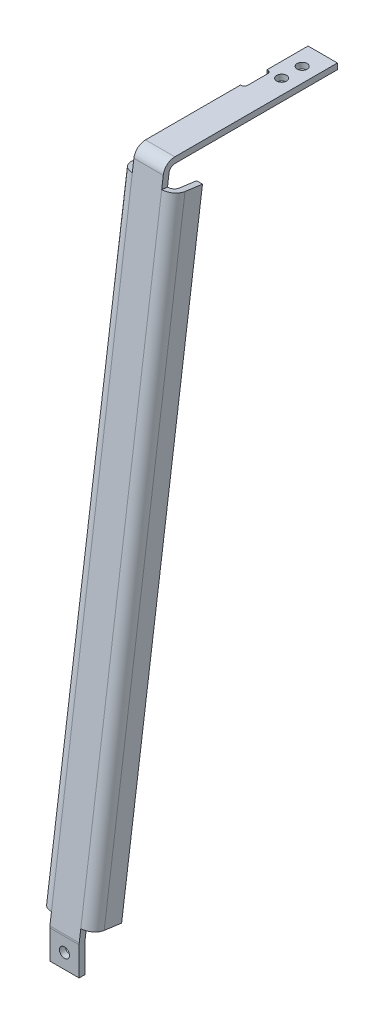
ISO-10303-21;
HEADER;
FILE_DESCRIPTION(('STEP AP214'),'2;1');
FILE_NAME('part.step','',(''),(''),'','','');
FILE_SCHEMA(('AUTOMOTIVE_DESIGN { 1 0 10303 214 1 1 1 1 }'));
ENDSEC;
DATA;
#1=APPLICATION_CONTEXT('core data for automotive mechanical design processes');
#2=APPLICATION_PROTOCOL_DEFINITION('international standard','automotive_design',2000,#1);
#3=PRODUCT_CONTEXT('',#1,'mechanical');
#4=PRODUCT('Part','Part','',(#3));
#5=PRODUCT_RELATED_PRODUCT_CATEGORY('part','',(#4));
#6=PRODUCT_DEFINITION_FORMATION('','',#4);
#7=PRODUCT_DEFINITION_CONTEXT('part definition',#1,'design');
#8=PRODUCT_DEFINITION('design','',#6,#7);
#9=PRODUCT_DEFINITION_SHAPE('','',#8);
#10=(LENGTH_UNIT() NAMED_UNIT(*) SI_UNIT(.MILLI.,.METRE.));
#11=(NAMED_UNIT(*) PLANE_ANGLE_UNIT() SI_UNIT($,.RADIAN.));
#12=(NAMED_UNIT(*) SI_UNIT($,.STERADIAN.) SOLID_ANGLE_UNIT());
#13=UNCERTAINTY_MEASURE_WITH_UNIT(LENGTH_MEASURE(1.E-05),#10,'distance_accuracy_value','');
#14=(GEOMETRIC_REPRESENTATION_CONTEXT(3) GLOBAL_UNCERTAINTY_ASSIGNED_CONTEXT((#13)) GLOBAL_UNIT_ASSIGNED_CONTEXT((#10,
#11,#12)) REPRESENTATION_CONTEXT('',''));
#15=CARTESIAN_POINT('',(0.,0.,0.));
#16=DIRECTION('',(0.,0.,1.));
#17=DIRECTION('',(1.,0.,0.));
#18=AXIS2_PLACEMENT_3D('',#15,#16,#17);
#19=CARTESIAN_POINT('',(-30.,-68.,77.3774837469467));
#20=DIRECTION('',(1.,0.,0.));
#21=DIRECTION('',(0.,0.,-1.));
#22=AXIS2_PLACEMENT_3D('',#19,#20,#21);
#23=PLANE('',#22);
#24=DIRECTION('',(0.,1.,0.));
#25=VECTOR('',#24,1.);
#26=CARTESIAN_POINT('',(-30.,-66.2,36.));
#27=LINE('',#26,#25);
#28=CARTESIAN_POINT('',(-30.,-66.,36.));
#29=VERTEX_POINT('',#28);
#30=CARTESIAN_POINT('',(-30.,-64.,36.));
#31=VERTEX_POINT('',#30);
#32=EDGE_CURVE('E360',#29,#31,#27,.T.);
#33=ORIENTED_EDGE('',*,*,#32,.T.);
#34=DIRECTION('',(0.,0.,1.));
#35=VECTOR('',#34,1.);
#36=CARTESIAN_POINT('',(-30.,-64.,22.));
#37=LINE('',#36,#35);
#38=CARTESIAN_POINT('',(-30.,-64.,22.));
#39=VERTEX_POINT('',#38);
#40=EDGE_CURVE('E479',#39,#31,#37,.T.);
#41=ORIENTED_EDGE('',*,*,#40,.F.);
#42=DIRECTION('',(0.,1.,0.));
#43=VECTOR('',#42,1.);
#44=CARTESIAN_POINT('',(-30.,-66.,22.));
#45=LINE('',#44,#43);
#46=CARTESIAN_POINT('',(-30.,-66.,22.));
#47=VERTEX_POINT('',#46);
#48=EDGE_CURVE('E417',#47,#39,#45,.T.);
#49=ORIENTED_EDGE('',*,*,#48,.F.);
#50=DIRECTION('',(0.,0.,-1.));
#51=VECTOR('',#50,1.);
#52=CARTESIAN_POINT('',(-30.,-66.,77.3774837469467));
#53=LINE('',#52,#51);
#54=EDGE_CURVE('E263',#29,#47,#53,.T.);
#55=ORIENTED_EDGE('',*,*,#54,.F.);
#56=EDGE_LOOP('',(#33,#41,#49,#55));
#57=FACE_BOUND('',#56,.T.);
#58=ADVANCED_FACE('F41',(#57),#23,.F.);
#59=DIRECTION('',(0.,1.,0.));
#60=VECTOR('',#59,1.);
#61=CARTESIAN_POINT('',(-30.,-66.2,45.));
#62=LINE('',#61,#60);
#63=CARTESIAN_POINT('',(-30.,-66.,45.));
#64=VERTEX_POINT('',#63);
#65=CARTESIAN_POINT('',(-30.,-64.,45.));
#66=VERTEX_POINT('',#65);
#67=EDGE_CURVE('E236',#64,#66,#62,.T.);
#68=ORIENTED_EDGE('',*,*,#67,.F.);
#69=CARTESIAN_POINT('',(-30.,-66.,77.3774837469467));
#70=VERTEX_POINT('',#69);
#71=EDGE_CURVE('E253',#70,#64,#53,.T.);
#72=ORIENTED_EDGE('',*,*,#71,.F.);
#73=CARTESIAN_POINT('',(-30.,-68.,77.3774837469467));
#74=DIRECTION('',(-1.,0.,0.));
#75=DIRECTION('',(0.,0.,-1.));
#76=AXIS2_PLACEMENT_3D('',#73,#74,#75);
#77=CIRCLE('',#76,2.);
#78=CARTESIAN_POINT('',(-30.,-67.7326535951247,79.3595346796425));
#79=VERTEX_POINT('',#78);
#80=EDGE_CURVE('E268',#79,#70,#77,.T.);
#81=ORIENTED_EDGE('',*,*,#80,.F.);
#82=DIRECTION('',(0.,0.991025466347899,-0.133673202437624));
#83=VECTOR('',#82,1.);
#84=CARTESIAN_POINT('',(-30.,-279.934067195348,107.982050932696));
#85=LINE('',#84,#83);
#86=CARTESIAN_POINT('',(-30.,-71.6967554605164,79.894227489393));
#87=VERTEX_POINT('',#86);
#88=EDGE_CURVE('E500',#87,#79,#85,.T.);
#89=ORIENTED_EDGE('',*,*,#88,.F.);
#90=DIRECTION('',(0.,-0.133673202437623,-0.991025466347899));
#91=VECTOR('',#90,1.);
#92=CARTESIAN_POINT('',(-30.,-71.9641018653916,77.9121765566972));
#93=LINE('',#92,#91);
#94=CARTESIAN_POINT('',(-30.,-71.4294090556411,81.8762784220888));
#95=VERTEX_POINT('',#94);
#96=EDGE_CURVE('E307',#95,#87,#93,.T.);
#97=ORIENTED_EDGE('',*,*,#96,.F.);
#98=DIRECTION('',(0.,-0.991025466347899,0.133673202437623));
#99=VECTOR('',#98,1.);
#100=CARTESIAN_POINT('',(-30.,-67.4653071902495,81.3415856123383));
#101=LINE('',#100,#99);
#102=CARTESIAN_POINT('',(-30.,-67.4653071902495,81.3415856123383));
#103=VERTEX_POINT('',#102);
#104=EDGE_CURVE('E484',#103,#95,#101,.T.);
#105=ORIENTED_EDGE('',*,*,#104,.F.);
#106=CARTESIAN_POINT('',(-30.,-68.,77.3774837469467));
#107=DIRECTION('',(1.,0.,0.));
#108=DIRECTION('',(0.,0.,-1.));
#109=AXIS2_PLACEMENT_3D('',#106,#107,#108);
#110=CIRCLE('',#109,4.00000000000001);
#111=CARTESIAN_POINT('',(-30.,-64.,77.3774837469467));
#112=VERTEX_POINT('',#111);
#113=EDGE_CURVE('E485',#112,#103,#110,.T.);
#114=ORIENTED_EDGE('',*,*,#113,.F.);
#115=EDGE_CURVE('E251',#66,#112,#37,.T.);
#116=ORIENTED_EDGE('',*,*,#115,.F.);
#117=EDGE_LOOP('',(#68,#72,#81,#89,#97,#105,#114,#116));
#118=FACE_BOUND('',#117,.T.);
#119=ADVANCED_FACE('F246',(#118),#23,.F.);
#120=CARTESIAN_POINT('',(-20.,-68.,77.3774837469467));
#121=DIRECTION('',(1.,0.,0.));
#122=DIRECTION('',(0.,0.,-1.));
#123=AXIS2_PLACEMENT_3D('',#120,#121,#122);
#124=PLANE('',#123);
#125=DIRECTION('',(0.,-0.991025466347899,0.133673202437623));
#126=VECTOR('',#125,1.);
#127=CARTESIAN_POINT('',(-20.,-67.4653071902495,81.3415856123383));
#128=LINE('',#127,#126);
#129=CARTESIAN_POINT('',(-20.,-67.4653071902495,81.3415856123383));
#130=VERTEX_POINT('',#129);
#131=CARTESIAN_POINT('',(-20.,-71.4294090556411,81.8762784220888));
#132=VERTEX_POINT('',#131);
#133=EDGE_CURVE('E460',#130,#132,#128,.T.);
#134=ORIENTED_EDGE('',*,*,#133,.T.);
#135=DIRECTION('',(0.,-0.133673202437623,-0.991025466347899));
#136=VECTOR('',#135,1.);
#137=CARTESIAN_POINT('',(-20.,-71.9641018653916,77.9121765566972));
#138=LINE('',#137,#136);
#139=CARTESIAN_POINT('',(-20.,-71.6967554605163,79.894227489393));
#140=VERTEX_POINT('',#139);
#141=EDGE_CURVE('E315',#132,#140,#138,.T.);
#142=ORIENTED_EDGE('',*,*,#141,.T.);
#143=DIRECTION('',(0.,0.991025466347899,-0.133673202437624));
#144=VECTOR('',#143,1.);
#145=CARTESIAN_POINT('',(-20.,-279.934067195348,107.982050932696));
#146=LINE('',#145,#144);
#147=CARTESIAN_POINT('',(-20.,-67.7326535951247,79.3595346796425));
#148=VERTEX_POINT('',#147);
#149=EDGE_CURVE('E468',#140,#148,#146,.T.);
#150=ORIENTED_EDGE('',*,*,#149,.T.);
#151=CARTESIAN_POINT('',(-20.,-68.,77.3774837469467));
#152=DIRECTION('',(-1.,0.,0.));
#153=DIRECTION('',(0.,0.,-1.));
#154=AXIS2_PLACEMENT_3D('',#151,#152,#153);
#155=CIRCLE('',#154,2.);
#156=CARTESIAN_POINT('',(-20.,-66.,77.3774837469467));
#157=VERTEX_POINT('',#156);
#158=EDGE_CURVE('E475',#148,#157,#155,.T.);
#159=ORIENTED_EDGE('',*,*,#158,.T.);
#160=DIRECTION('',(0.,0.,-1.));
#161=VECTOR('',#160,1.);
#162=CARTESIAN_POINT('',(-20.,-66.,77.3774837469467));
#163=LINE('',#162,#161);
#164=CARTESIAN_POINT('',(-20.,-66.,22.));
#165=VERTEX_POINT('',#164);
#166=EDGE_CURVE('E274',#157,#165,#163,.T.);
#167=ORIENTED_EDGE('',*,*,#166,.T.);
#168=DIRECTION('',(0.,1.,0.));
#169=VECTOR('',#168,1.);
#170=CARTESIAN_POINT('',(-20.,-66.,22.));
#171=LINE('',#170,#169);
#172=CARTESIAN_POINT('',(-20.,-64.,22.));
#173=VERTEX_POINT('',#172);
#174=EDGE_CURVE('E265',#165,#173,#171,.T.);
#175=ORIENTED_EDGE('',*,*,#174,.T.);
#176=DIRECTION('',(0.,0.,1.));
#177=VECTOR('',#176,1.);
#178=CARTESIAN_POINT('',(-20.,-64.,22.));
#179=LINE('',#178,#177);
#180=CARTESIAN_POINT('',(-20.,-64.,77.3774837469467));
#181=VERTEX_POINT('',#180);
#182=EDGE_CURVE('E266',#173,#181,#179,.T.);
#183=ORIENTED_EDGE('',*,*,#182,.T.);
#184=CARTESIAN_POINT('',(-20.,-68.,77.3774837469467));
#185=DIRECTION('',(1.,0.,0.));
#186=DIRECTION('',(0.,0.,-1.));
#187=AXIS2_PLACEMENT_3D('',#184,#185,#186);
#188=CIRCLE('',#187,4.00000000000001);
#189=EDGE_CURVE('E451',#181,#130,#188,.T.);
#190=ORIENTED_EDGE('',*,*,#189,.T.);
#191=EDGE_LOOP('',(#134,#142,#150,#159,#167,#175,#183,#190));
#192=FACE_BOUND('',#191,.T.);
#193=ADVANCED_FACE('F515',(#192),#124,.T.);
#194=CARTESIAN_POINT('',(-20.,-66.,22.));
#195=DIRECTION('',(0.,0.,1.));
#196=DIRECTION('',(1.,0.,0.));
#197=AXIS2_PLACEMENT_3D('',#194,#195,#196);
#198=PLANE('',#197);
#199=ORIENTED_EDGE('',*,*,#48,.T.);
#200=DIRECTION('',(-1.,0.,0.));
#201=VECTOR('',#200,1.);
#202=CARTESIAN_POINT('',(-20.,-64.,22.));
#203=LINE('',#202,#201);
#204=EDGE_CURVE('E301',#173,#39,#203,.T.);
#205=ORIENTED_EDGE('',*,*,#204,.F.);
#206=ORIENTED_EDGE('',*,*,#174,.F.);
#207=DIRECTION('',(-1.,0.,0.));
#208=VECTOR('',#207,1.);
#209=CARTESIAN_POINT('',(-20.,-66.,22.));
#210=LINE('',#209,#208);
#211=EDGE_CURVE('E275',#165,#47,#210,.T.);
#212=ORIENTED_EDGE('',*,*,#211,.T.);
#213=EDGE_LOOP('',(#199,#205,#206,#212));
#214=FACE_BOUND('',#213,.T.);
#215=ADVANCED_FACE('F43',(#214),#198,.F.);
#216=CARTESIAN_POINT('',(-20.,-64.,22.));
#217=DIRECTION('',(0.,-1.,0.));
#218=DIRECTION('',(0.,0.,-1.));
#219=AXIS2_PLACEMENT_3D('',#216,#217,#218);
#220=PLANE('',#219);
#221=DIRECTION('',(-1.,0.,0.));
#222=VECTOR('',#221,1.);
#223=CARTESIAN_POINT('',(-20.,-64.,36.));
#224=LINE('',#223,#222);
#225=CARTESIAN_POINT('',(-29.7,-64.,36.));
#226=VERTEX_POINT('',#225);
#227=EDGE_CURVE('E330',#226,#31,#224,.T.);
#228=ORIENTED_EDGE('',*,*,#227,.F.);
#229=CARTESIAN_POINT('',(-29.7,-64.,37.));
#230=DIRECTION('',(0.,-1.,0.));
#231=DIRECTION('',(0.,0.,-1.));
#232=AXIS2_PLACEMENT_3D('',#229,#230,#231);
#233=CIRCLE('',#232,0.999999999999997);
#234=CARTESIAN_POINT('',(-28.7,-64.,37.));
#235=VERTEX_POINT('',#234);
#236=EDGE_CURVE('E364',#235,#226,#233,.F.);
#237=ORIENTED_EDGE('',*,*,#236,.F.);
#238=DIRECTION('',(0.,0.,-1.));
#239=VECTOR('',#238,1.);
#240=CARTESIAN_POINT('',(-28.7,-64.,22.));
#241=LINE('',#240,#239);
#242=CARTESIAN_POINT('',(-28.7,-64.,44.));
#243=VERTEX_POINT('',#242);
#244=EDGE_CURVE('E350',#243,#235,#241,.T.);
#245=ORIENTED_EDGE('',*,*,#244,.F.);
#246=CARTESIAN_POINT('',(-29.7,-64.,44.));
#247=DIRECTION('',(0.,-1.,0.));
#248=DIRECTION('',(0.,0.,-1.));
#249=AXIS2_PLACEMENT_3D('',#246,#247,#248);
#250=CIRCLE('',#249,1.);
#251=CARTESIAN_POINT('',(-29.7,-64.,45.));
#252=VERTEX_POINT('',#251);
#253=EDGE_CURVE('E351',#252,#243,#250,.F.);
#254=ORIENTED_EDGE('',*,*,#253,.F.);
#255=DIRECTION('',(1.,0.,0.));
#256=VECTOR('',#255,1.);
#257=CARTESIAN_POINT('',(-20.,-64.,45.));
#258=LINE('',#257,#256);
#259=EDGE_CURVE('E363',#66,#252,#258,.T.);
#260=ORIENTED_EDGE('',*,*,#259,.F.);
#261=ORIENTED_EDGE('',*,*,#115,.T.);
#262=DIRECTION('',(-1.,0.,0.));
#263=VECTOR('',#262,1.);
#264=CARTESIAN_POINT('',(-20.,-64.,77.3774837469467));
#265=LINE('',#264,#263);
#266=EDGE_CURVE('E302',#181,#112,#265,.T.);
#267=ORIENTED_EDGE('',*,*,#266,.F.);
#268=ORIENTED_EDGE('',*,*,#182,.F.);
#269=ORIENTED_EDGE('',*,*,#204,.T.);
#270=ORIENTED_EDGE('',*,*,#40,.T.);
#271=EDGE_LOOP('',(#228,#237,#245,#254,#260,#261,#267,#268,#269,#270));
#272=FACE_BOUND('',#271,.T.);
#273=CARTESIAN_POINT('',(-25.,-64.,29.));
#274=DIRECTION('',(0.,-1.,0.));
#275=DIRECTION('',(0.,0.,-1.));
#276=AXIS2_PLACEMENT_3D('',#273,#274,#275);
#277=CIRCLE('',#276,1.7);
#278=CARTESIAN_POINT('',(-25.,-64.,27.3));
#279=VERTEX_POINT('',#278);
#280=EDGE_CURVE('E322',#279,#279,#277,.F.);
#281=ORIENTED_EDGE('',*,*,#280,.F.);
#282=EDGE_LOOP('',(#281));
#283=FACE_BOUND('',#282,.T.);
#284=CARTESIAN_POINT('',(-25.,-64.,36.));
#285=DIRECTION('',(0.,-1.,0.));
#286=DIRECTION('',(0.,0.,-1.));
#287=AXIS2_PLACEMENT_3D('',#284,#285,#286);
#288=CIRCLE('',#287,1.7);
#289=CARTESIAN_POINT('',(-25.,-64.,34.3));
#290=VERTEX_POINT('',#289);
#291=EDGE_CURVE('E317',#290,#290,#288,.F.);
#292=ORIENTED_EDGE('',*,*,#291,.F.);
#293=EDGE_LOOP('',(#292));
#294=FACE_BOUND('',#293,.T.);
#295=ADVANCED_FACE('F573',(#272,#283,#294),#220,.F.);
#296=CARTESIAN_POINT('',(-20.,-68.,77.3774837469467));
#297=DIRECTION('',(-1.,0.,0.));
#298=DIRECTION('',(0.,0.,1.));
#299=AXIS2_PLACEMENT_3D('',#296,#297,#298);
#300=CYLINDRICAL_SURFACE('',#299,4.00000000000001);
#301=ORIENTED_EDGE('',*,*,#113,.T.);
#302=DIRECTION('',(-1.,0.,0.));
#303=VECTOR('',#302,1.);
#304=CARTESIAN_POINT('',(-20.,-67.4653071902495,81.3415856123383));
#305=LINE('',#304,#303);
#306=EDGE_CURVE('E296',#130,#103,#305,.T.);
#307=ORIENTED_EDGE('',*,*,#306,.F.);
#308=ORIENTED_EDGE('',*,*,#189,.F.);
#309=ORIENTED_EDGE('',*,*,#266,.T.);
#310=EDGE_LOOP('',(#301,#307,#308,#309));
#311=FACE_BOUND('',#310,.T.);
#312=ADVANCED_FACE('F570',(#311),#300,.T.);
#313=CARTESIAN_POINT('',(-20.,-67.4653071902495,81.3415856123383));
#314=DIRECTION('',(0.,-0.133673202437623,-0.991025466347899));
#315=DIRECTION('',(0.,0.991025466347899,-0.133673202437623));
#316=AXIS2_PLACEMENT_3D('',#313,#314,#315);
#317=PLANE('',#316);
#318=ORIENTED_EDGE('',*,*,#104,.T.);
#319=DIRECTION('',(0.,0.991025466347899,-0.133673202437623));
#320=VECTOR('',#319,1.);
#321=CARTESIAN_POINT('',(-30.,-275.702618925081,109.429409055641));
#322=LINE('',#321,#320);
#323=CARTESIAN_POINT('',(-30.,-275.702618925081,109.429409055641));
#324=VERTEX_POINT('',#323);
#325=EDGE_CURVE('E389',#324,#95,#322,.T.);
#326=ORIENTED_EDGE('',*,*,#325,.F.);
#327=CARTESIAN_POINT('',(-30.,-279.666720790473,109.964101865392));
#328=VERTEX_POINT('',#327);
#329=EDGE_CURVE('E482',#324,#328,#101,.T.);
#330=ORIENTED_EDGE('',*,*,#329,.T.);
#331=DIRECTION('',(-1.,0.,0.));
#332=VECTOR('',#331,1.);
#333=CARTESIAN_POINT('',(-20.,-279.666720790473,109.964101865392));
#334=LINE('',#333,#332);
#335=CARTESIAN_POINT('',(-20.,-279.666720790473,109.964101865392));
#336=VERTEX_POINT('',#335);
#337=EDGE_CURVE('E293',#336,#328,#334,.T.);
#338=ORIENTED_EDGE('',*,*,#337,.F.);
#339=CARTESIAN_POINT('',(-20.,-275.702618925081,109.429409055641));
#340=VERTEX_POINT('',#339);
#341=EDGE_CURVE('E457',#340,#336,#128,.T.);
#342=ORIENTED_EDGE('',*,*,#341,.F.);
#343=DIRECTION('',(0.,0.991025466347899,-0.133673202437623));
#344=VECTOR('',#343,1.);
#345=CARTESIAN_POINT('',(-20.,-275.702618925081,109.429409055641));
#346=LINE('',#345,#344);
#347=EDGE_CURVE('E372',#340,#132,#346,.T.);
#348=ORIENTED_EDGE('',*,*,#347,.T.);
#349=ORIENTED_EDGE('',*,*,#133,.F.);
#350=ORIENTED_EDGE('',*,*,#306,.T.);
#351=EDGE_LOOP('',(#318,#326,#330,#338,#342,#348,#349,#350));
#352=FACE_BOUND('',#351,.T.);
#353=ADVANCED_FACE('F564',(#352),#317,.F.);
#354=CARTESIAN_POINT('',(-20.,-280.201413600223,106.));
#355=DIRECTION('',(-1.,0.,0.));
#356=DIRECTION('',(0.,0.,1.));
#357=AXIS2_PLACEMENT_3D('',#354,#355,#356);
#358=CYLINDRICAL_SURFACE('',#357,3.99999999999999);
#359=CARTESIAN_POINT('',(-30.,-280.201413600223,106.));
#360=DIRECTION('',(1.,0.,0.));
#361=DIRECTION('',(0.,0.,-1.));
#362=AXIS2_PLACEMENT_3D('',#359,#360,#361);
#363=CIRCLE('',#362,3.99999999999999);
#364=CARTESIAN_POINT('',(-30.,-280.201413600223,110.));
#365=VERTEX_POINT('',#364);
#366=EDGE_CURVE('E488',#328,#365,#363,.T.);
#367=ORIENTED_EDGE('',*,*,#366,.T.);
#368=DIRECTION('',(-1.,0.,0.));
#369=VECTOR('',#368,1.);
#370=CARTESIAN_POINT('',(-20.,-280.201413600223,110.));
#371=LINE('',#370,#369);
#372=CARTESIAN_POINT('',(-20.,-280.201413600223,110.));
#373=VERTEX_POINT('',#372);
#374=EDGE_CURVE('E295',#373,#365,#371,.T.);
#375=ORIENTED_EDGE('',*,*,#374,.F.);
#376=CARTESIAN_POINT('',(-20.,-280.201413600223,106.));
#377=DIRECTION('',(1.,0.,0.));
#378=DIRECTION('',(0.,0.,-1.));
#379=AXIS2_PLACEMENT_3D('',#376,#377,#378);
#380=CIRCLE('',#379,3.99999999999999);
#381=EDGE_CURVE('E458',#336,#373,#380,.T.);
#382=ORIENTED_EDGE('',*,*,#381,.F.);
#383=ORIENTED_EDGE('',*,*,#337,.T.);
#384=EDGE_LOOP('',(#367,#375,#382,#383));
#385=FACE_BOUND('',#384,.T.);
#386=ADVANCED_FACE('F874',(#385),#358,.T.);
#387=CARTESIAN_POINT('',(-20.,-280.201413600223,110.));
#388=DIRECTION('',(0.,0.,-1.));
#389=DIRECTION('',(0.,1.,0.));
#390=AXIS2_PLACEMENT_3D('',#387,#388,#389);
#391=PLANE('',#390);
#392=CARTESIAN_POINT('',(-25.,-285.,110.));
#393=DIRECTION('',(0.,0.,-1.));
#394=DIRECTION('',(0.,1.,0.));
#395=AXIS2_PLACEMENT_3D('',#392,#393,#394);
#396=CIRCLE('',#395,1.7);
#397=CARTESIAN_POINT('',(-25.,-283.3,110.));
#398=VERTEX_POINT('',#397);
#399=EDGE_CURVE('E319',#398,#398,#396,.F.);
#400=ORIENTED_EDGE('',*,*,#399,.F.);
#401=EDGE_LOOP('',(#400));
#402=FACE_BOUND('',#401,.T.);
#403=DIRECTION('',(0.,-1.,0.));
#404=VECTOR('',#403,1.);
#405=CARTESIAN_POINT('',(-30.,-280.201413600223,110.));
#406=LINE('',#405,#404);
#407=CARTESIAN_POINT('',(-30.,-290.,110.));
#408=VERTEX_POINT('',#407);
#409=EDGE_CURVE('E489',#365,#408,#406,.T.);
#410=ORIENTED_EDGE('',*,*,#409,.T.);
#411=DIRECTION('',(-1.,0.,0.));
#412=VECTOR('',#411,1.);
#413=CARTESIAN_POINT('',(-20.,-290.,110.));
#414=LINE('',#413,#412);
#415=CARTESIAN_POINT('',(-20.,-290.,110.));
#416=VERTEX_POINT('',#415);
#417=EDGE_CURVE('E286',#416,#408,#414,.T.);
#418=ORIENTED_EDGE('',*,*,#417,.F.);
#419=DIRECTION('',(0.,-1.,0.));
#420=VECTOR('',#419,1.);
#421=CARTESIAN_POINT('',(-20.,-280.201413600223,110.));
#422=LINE('',#421,#420);
#423=EDGE_CURVE('E465',#373,#416,#422,.T.);
#424=ORIENTED_EDGE('',*,*,#423,.F.);
#425=ORIENTED_EDGE('',*,*,#374,.T.);
#426=EDGE_LOOP('',(#410,#418,#424,#425));
#427=FACE_BOUND('',#426,.T.);
#428=ADVANCED_FACE('F870',(#402,#427),#391,.F.);
#429=CARTESIAN_POINT('',(-20.,-290.,110.));
#430=DIRECTION('',(0.,1.,0.));
#431=DIRECTION('',(0.,0.,1.));
#432=AXIS2_PLACEMENT_3D('',#429,#430,#431);
#433=PLANE('',#432);
#434=DIRECTION('',(0.,0.,-1.));
#435=VECTOR('',#434,1.);
#436=CARTESIAN_POINT('',(-30.,-290.,110.));
#437=LINE('',#436,#435);
#438=CARTESIAN_POINT('',(-30.,-290.,108.));
#439=VERTEX_POINT('',#438);
#440=EDGE_CURVE('E495',#408,#439,#437,.T.);
#441=ORIENTED_EDGE('',*,*,#440,.T.);
#442=DIRECTION('',(-1.,0.,0.));
#443=VECTOR('',#442,1.);
#444=CARTESIAN_POINT('',(-20.,-290.,108.));
#445=LINE('',#444,#443);
#446=CARTESIAN_POINT('',(-20.,-290.,108.));
#447=VERTEX_POINT('',#446);
#448=EDGE_CURVE('E287',#447,#439,#445,.T.);
#449=ORIENTED_EDGE('',*,*,#448,.F.);
#450=DIRECTION('',(0.,0.,-1.));
#451=VECTOR('',#450,1.);
#452=CARTESIAN_POINT('',(-20.,-290.,110.));
#453=LINE('',#452,#451);
#454=EDGE_CURVE('E464',#416,#447,#453,.T.);
#455=ORIENTED_EDGE('',*,*,#454,.F.);
#456=ORIENTED_EDGE('',*,*,#417,.T.);
#457=EDGE_LOOP('',(#441,#449,#455,#456));
#458=FACE_BOUND('',#457,.T.);
#459=ADVANCED_FACE('F856',(#458),#433,.F.);
#460=CARTESIAN_POINT('',(-20.,-290.,108.));
#461=DIRECTION('',(0.,0.,1.));
#462=DIRECTION('',(1.,0.,0.));
#463=AXIS2_PLACEMENT_3D('',#460,#461,#462);
#464=PLANE('',#463);
#465=CARTESIAN_POINT('',(-25.,-285.,108.));
#466=DIRECTION('',(0.,0.,1.));
#467=DIRECTION('',(1.,0.,0.));
#468=AXIS2_PLACEMENT_3D('',#465,#466,#467);
#469=CIRCLE('',#468,1.7);
#470=CARTESIAN_POINT('',(-23.3,-285.,108.));
#471=VERTEX_POINT('',#470);
#472=EDGE_CURVE('E324',#471,#471,#469,.F.);
#473=ORIENTED_EDGE('',*,*,#472,.F.);
#474=EDGE_LOOP('',(#473));
#475=FACE_BOUND('',#474,.T.);
#476=DIRECTION('',(0.,1.,0.));
#477=VECTOR('',#476,1.);
#478=CARTESIAN_POINT('',(-30.,-290.,108.));
#479=LINE('',#478,#477);
#480=CARTESIAN_POINT('',(-30.,-280.201413600223,108.));
#481=VERTEX_POINT('',#480);
#482=EDGE_CURVE('E493',#439,#481,#479,.T.);
#483=ORIENTED_EDGE('',*,*,#482,.T.);
#484=DIRECTION('',(-1.,0.,0.));
#485=VECTOR('',#484,1.);
#486=CARTESIAN_POINT('',(-20.,-280.201413600223,108.));
#487=LINE('',#486,#485);
#488=CARTESIAN_POINT('',(-20.,-280.201413600223,108.));
#489=VERTEX_POINT('',#488);
#490=EDGE_CURVE('E281',#489,#481,#487,.T.);
#491=ORIENTED_EDGE('',*,*,#490,.F.);
#492=DIRECTION('',(0.,1.,0.));
#493=VECTOR('',#492,1.);
#494=CARTESIAN_POINT('',(-20.,-290.,108.));
#495=LINE('',#494,#493);
#496=EDGE_CURVE('E467',#447,#489,#495,.T.);
#497=ORIENTED_EDGE('',*,*,#496,.F.);
#498=ORIENTED_EDGE('',*,*,#448,.T.);
#499=EDGE_LOOP('',(#483,#491,#497,#498));
#500=FACE_BOUND('',#499,.T.);
#501=ADVANCED_FACE('F852',(#475,#500),#464,.F.);
#502=CARTESIAN_POINT('',(-20.,-280.201413600223,106.));
#503=DIRECTION('',(-1.,0.,0.));
#504=DIRECTION('',(0.,0.,1.));
#505=AXIS2_PLACEMENT_3D('',#502,#503,#504);
#506=CYLINDRICAL_SURFACE('',#505,2.00000000000001);
#507=CARTESIAN_POINT('',(-30.,-280.201413600223,106.));
#508=DIRECTION('',(-1.,0.,0.));
#509=DIRECTION('',(0.,0.,-1.));
#510=AXIS2_PLACEMENT_3D('',#507,#508,#509);
#511=CIRCLE('',#510,2.00000000000001);
#512=CARTESIAN_POINT('',(-30.,-279.934067195348,107.982050932696));
#513=VERTEX_POINT('',#512);
#514=EDGE_CURVE('E497',#481,#513,#511,.T.);
#515=ORIENTED_EDGE('',*,*,#514,.T.);
#516=DIRECTION('',(-1.,0.,0.));
#517=VECTOR('',#516,1.);
#518=CARTESIAN_POINT('',(-20.,-279.934067195348,107.982050932696));
#519=LINE('',#518,#517);
#520=CARTESIAN_POINT('',(-20.,-279.934067195348,107.982050932696));
#521=VERTEX_POINT('',#520);
#522=EDGE_CURVE('E278',#521,#513,#519,.T.);
#523=ORIENTED_EDGE('',*,*,#522,.F.);
#524=CARTESIAN_POINT('',(-20.,-280.201413600223,106.));
#525=DIRECTION('',(-1.,0.,0.));
#526=DIRECTION('',(0.,0.,-1.));
#527=AXIS2_PLACEMENT_3D('',#524,#525,#526);
#528=CIRCLE('',#527,2.00000000000001);
#529=EDGE_CURVE('E470',#489,#521,#528,.T.);
#530=ORIENTED_EDGE('',*,*,#529,.F.);
#531=ORIENTED_EDGE('',*,*,#490,.T.);
#532=EDGE_LOOP('',(#515,#523,#530,#531));
#533=FACE_BOUND('',#532,.T.);
#534=ADVANCED_FACE('F528',(#533),#506,.F.);
#535=CARTESIAN_POINT('',(-20.,-279.934067195348,107.982050932696));
#536=DIRECTION('',(0.,0.133673202437624,0.991025466347899));
#537=DIRECTION('',(0.,-0.991025466347899,0.133673202437624));
#538=AXIS2_PLACEMENT_3D('',#535,#536,#537);
#539=PLANE('',#538);
#540=DIRECTION('',(0.,0.991025466347899,-0.133673202437623));
#541=VECTOR('',#540,1.);
#542=CARTESIAN_POINT('',(-20.,-275.969965329956,107.447358122945));
#543=LINE('',#542,#541);
#544=CARTESIAN_POINT('',(-20.,-275.969965329956,107.447358122945));
#545=VERTEX_POINT('',#544);
#546=EDGE_CURVE('E419',#545,#140,#543,.T.);
#547=ORIENTED_EDGE('',*,*,#546,.F.);
#548=EDGE_CURVE('E473',#521,#545,#146,.T.);
#549=ORIENTED_EDGE('',*,*,#548,.F.);
#550=ORIENTED_EDGE('',*,*,#522,.T.);
#551=CARTESIAN_POINT('',(-30.,-275.969965329956,107.447358122945));
#552=VERTEX_POINT('',#551);
#553=EDGE_CURVE('E499',#513,#552,#85,.T.);
#554=ORIENTED_EDGE('',*,*,#553,.T.);
#555=DIRECTION('',(0.,0.991025466347899,-0.133673202437623));
#556=VECTOR('',#555,1.);
#557=CARTESIAN_POINT('',(-30.,-275.969965329956,107.447358122945));
#558=LINE('',#557,#556);
#559=EDGE_CURVE('E401',#552,#87,#558,.T.);
#560=ORIENTED_EDGE('',*,*,#559,.T.);
#561=ORIENTED_EDGE('',*,*,#88,.T.);
#562=DIRECTION('',(-1.,0.,0.));
#563=VECTOR('',#562,1.);
#564=CARTESIAN_POINT('',(-20.,-67.7326535951247,79.3595346796425));
#565=LINE('',#564,#563);
#566=EDGE_CURVE('E280',#148,#79,#565,.T.);
#567=ORIENTED_EDGE('',*,*,#566,.F.);
#568=ORIENTED_EDGE('',*,*,#149,.F.);
#569=EDGE_LOOP('',(#547,#549,#550,#554,#560,#561,#567,#568));
#570=FACE_BOUND('',#569,.T.);
#571=ADVANCED_FACE('F502',(#570),#539,.F.);
#572=CARTESIAN_POINT('',(-20.,-68.,77.3774837469467));
#573=DIRECTION('',(-1.,0.,0.));
#574=DIRECTION('',(0.,0.,1.));
#575=AXIS2_PLACEMENT_3D('',#572,#573,#574);
#576=CYLINDRICAL_SURFACE('',#575,2.);
#577=ORIENTED_EDGE('',*,*,#80,.T.);
#578=DIRECTION('',(-1.,0.,0.));
#579=VECTOR('',#578,1.);
#580=CARTESIAN_POINT('',(-20.,-66.,77.3774837469467));
#581=LINE('',#580,#579);
#582=EDGE_CURVE('E261',#157,#70,#581,.T.);
#583=ORIENTED_EDGE('',*,*,#582,.F.);
#584=ORIENTED_EDGE('',*,*,#158,.F.);
#585=ORIENTED_EDGE('',*,*,#566,.T.);
#586=EDGE_LOOP('',(#577,#583,#584,#585));
#587=FACE_BOUND('',#586,.T.);
#588=ADVANCED_FACE('F508',(#587),#576,.F.);
#589=CARTESIAN_POINT('',(-20.,-66.,77.3774837469467));
#590=DIRECTION('',(0.,1.,0.));
#591=DIRECTION('',(0.,0.,1.));
#592=AXIS2_PLACEMENT_3D('',#589,#590,#591);
#593=PLANE('',#592);
#594=DIRECTION('',(1.,0.,0.));
#595=VECTOR('',#594,1.);
#596=CARTESIAN_POINT('',(-20.,-66.,36.));
#597=LINE('',#596,#595);
#598=CARTESIAN_POINT('',(-29.7,-66.,36.));
#599=VERTEX_POINT('',#598);
#600=EDGE_CURVE('E11',#29,#599,#597,.T.);
#601=ORIENTED_EDGE('',*,*,#600,.F.);
#602=ORIENTED_EDGE('',*,*,#54,.T.);
#603=ORIENTED_EDGE('',*,*,#211,.F.);
#604=ORIENTED_EDGE('',*,*,#166,.F.);
#605=ORIENTED_EDGE('',*,*,#582,.T.);
#606=ORIENTED_EDGE('',*,*,#71,.T.);
#607=DIRECTION('',(-1.,0.,0.));
#608=VECTOR('',#607,1.);
#609=CARTESIAN_POINT('',(-20.,-66.,45.));
#610=LINE('',#609,#608);
#611=CARTESIAN_POINT('',(-29.7,-66.,45.));
#612=VERTEX_POINT('',#611);
#613=EDGE_CURVE('E233',#612,#64,#610,.T.);
#614=ORIENTED_EDGE('',*,*,#613,.F.);
#615=CARTESIAN_POINT('',(-29.7,-66.,44.));
#616=DIRECTION('',(0.,1.,0.));
#617=DIRECTION('',(0.,0.,1.));
#618=AXIS2_PLACEMENT_3D('',#615,#616,#617);
#619=CIRCLE('',#618,1.);
#620=CARTESIAN_POINT('',(-28.7,-66.,44.));
#621=VERTEX_POINT('',#620);
#622=EDGE_CURVE('E241',#621,#612,#619,.F.);
#623=ORIENTED_EDGE('',*,*,#622,.F.);
#624=DIRECTION('',(0.,0.,1.));
#625=VECTOR('',#624,1.);
#626=CARTESIAN_POINT('',(-28.7,-66.,77.3774837469467));
#627=LINE('',#626,#625);
#628=CARTESIAN_POINT('',(-28.7,-66.,37.));
#629=VERTEX_POINT('',#628);
#630=EDGE_CURVE('E329',#629,#621,#627,.T.);
#631=ORIENTED_EDGE('',*,*,#630,.F.);
#632=CARTESIAN_POINT('',(-29.7,-66.,37.));
#633=DIRECTION('',(0.,1.,0.));
#634=DIRECTION('',(0.,0.,1.));
#635=AXIS2_PLACEMENT_3D('',#632,#633,#634);
#636=CIRCLE('',#635,0.999999999999997);
#637=EDGE_CURVE('E47',#599,#629,#636,.F.);
#638=ORIENTED_EDGE('',*,*,#637,.F.);
#639=EDGE_LOOP('',(#601,#602,#603,#604,#605,#606,#614,#623,#631,#638));
#640=FACE_BOUND('',#639,.T.);
#641=CARTESIAN_POINT('',(-25.,-66.,29.));
#642=DIRECTION('',(0.,1.,0.));
#643=DIRECTION('',(0.,0.,1.));
#644=AXIS2_PLACEMENT_3D('',#641,#642,#643);
#645=CIRCLE('',#644,1.7);
#646=CARTESIAN_POINT('',(-25.,-66.,30.7));
#647=VERTEX_POINT('',#646);
#648=EDGE_CURVE('E321',#647,#647,#645,.F.);
#649=ORIENTED_EDGE('',*,*,#648,.F.);
#650=EDGE_LOOP('',(#649));
#651=FACE_BOUND('',#650,.T.);
#652=CARTESIAN_POINT('',(-25.,-66.,36.));
#653=DIRECTION('',(0.,1.,0.));
#654=DIRECTION('',(0.,0.,1.));
#655=AXIS2_PLACEMENT_3D('',#652,#653,#654);
#656=CIRCLE('',#655,1.7);
#657=CARTESIAN_POINT('',(-25.,-66.,37.7));
#658=VERTEX_POINT('',#657);
#659=EDGE_CURVE('E316',#658,#658,#656,.F.);
#660=ORIENTED_EDGE('',*,*,#659,.F.);
#661=EDGE_LOOP('',(#660));
#662=FACE_BOUND('',#661,.T.);
#663=ADVANCED_FACE('F260',(#640,#651,#662),#593,.F.);
#664=DIRECTION('',(0.,-0.133673202437623,-0.991025466347899));
#665=VECTOR('',#664,1.);
#666=CARTESIAN_POINT('',(-20.,-276.237311734832,105.465307190249));
#667=LINE('',#666,#665);
#668=EDGE_CURVE('E244',#340,#545,#667,.T.);
#669=ORIENTED_EDGE('',*,*,#668,.F.);
#670=ORIENTED_EDGE('',*,*,#341,.T.);
#671=ORIENTED_EDGE('',*,*,#381,.T.);
#672=ORIENTED_EDGE('',*,*,#423,.T.);
#673=ORIENTED_EDGE('',*,*,#454,.T.);
#674=ORIENTED_EDGE('',*,*,#496,.T.);
#675=ORIENTED_EDGE('',*,*,#529,.T.);
#676=ORIENTED_EDGE('',*,*,#548,.T.);
#677=EDGE_LOOP('',(#669,#670,#671,#672,#673,#674,#675,#676));
#678=FACE_BOUND('',#677,.T.);
#679=ADVANCED_FACE('F519',(#678),#124,.T.);
#680=ORIENTED_EDGE('',*,*,#329,.F.);
#681=DIRECTION('',(0.,-0.133673202437623,-0.991025466347899));
#682=VECTOR('',#681,1.);
#683=CARTESIAN_POINT('',(-30.,-276.237311734832,105.465307190249));
#684=LINE('',#683,#682);
#685=EDGE_CURVE('E309',#324,#552,#684,.T.);
#686=ORIENTED_EDGE('',*,*,#685,.T.);
#687=ORIENTED_EDGE('',*,*,#553,.F.);
#688=ORIENTED_EDGE('',*,*,#514,.F.);
#689=ORIENTED_EDGE('',*,*,#482,.F.);
#690=ORIENTED_EDGE('',*,*,#440,.F.);
#691=ORIENTED_EDGE('',*,*,#409,.F.);
#692=ORIENTED_EDGE('',*,*,#366,.F.);
#693=EDGE_LOOP('',(#680,#686,#687,#688,#689,#690,#691,#692));
#694=FACE_BOUND('',#693,.T.);
#695=ADVANCED_FACE('F530',(#694),#23,.F.);
#696=CARTESIAN_POINT('',(-30.,-276.237311734832,105.465307190249));
#697=DIRECTION('',(0.,-0.991025466347899,0.133673202437623));
#698=DIRECTION('',(0.,-0.133673202437623,-0.991025466347899));
#699=AXIS2_PLACEMENT_3D('',#696,#697,#698);
#700=PLANE('',#699);
#701=ORIENTED_EDGE('',*,*,#685,.F.);
#702=CARTESIAN_POINT('',(-30.,-276.237311734832,105.465307190249));
#703=DIRECTION('',(0.,-0.991025466347899,0.133673202437623));
#704=DIRECTION('',(0.,-0.133673202437623,-0.991025466347899));
#705=AXIS2_PLACEMENT_3D('',#702,#703,#704);
#706=CIRCLE('',#705,4.00000000000001);
#707=CARTESIAN_POINT('',(-34.,-276.237311734832,105.465307190249));
#708=VERTEX_POINT('',#707);
#709=EDGE_CURVE('E374',#324,#708,#706,.T.);
#710=ORIENTED_EDGE('',*,*,#709,.T.);
#711=DIRECTION('',(0.,-0.133673202437623,-0.991025466347899));
#712=VECTOR('',#711,1.);
#713=CARTESIAN_POINT('',(-34.,-276.237311734832,105.465307190249));
#714=LINE('',#713,#712);
#715=CARTESIAN_POINT('',(-34.,-277.039350949457,99.519154392162));
#716=VERTEX_POINT('',#715);
#717=EDGE_CURVE('E378',#708,#716,#714,.T.);
#718=ORIENTED_EDGE('',*,*,#717,.T.);
#719=DIRECTION('',(1.,0.,0.));
#720=VECTOR('',#719,1.);
#721=CARTESIAN_POINT('',(-34.,-277.039350949457,99.519154392162));
#722=LINE('',#721,#720);
#723=CARTESIAN_POINT('',(-32.,-277.039350949457,99.519154392162));
#724=VERTEX_POINT('',#723);
#725=EDGE_CURVE('E381',#716,#724,#722,.T.);
#726=ORIENTED_EDGE('',*,*,#725,.T.);
#727=DIRECTION('',(0.,0.133673202437623,0.991025466347899));
#728=VECTOR('',#727,1.);
#729=CARTESIAN_POINT('',(-32.,-277.039350949457,99.519154392162));
#730=LINE('',#729,#728);
#731=CARTESIAN_POINT('',(-32.,-276.237311734832,105.465307190249));
#732=VERTEX_POINT('',#731);
#733=EDGE_CURVE('E382',#724,#732,#730,.T.);
#734=ORIENTED_EDGE('',*,*,#733,.T.);
#735=CARTESIAN_POINT('',(-30.,-276.237311734832,105.465307190249));
#736=DIRECTION('',(0.,0.991025466347899,-0.133673202437623));
#737=DIRECTION('',(0.,-0.133673202437623,-0.991025466347899));
#738=AXIS2_PLACEMENT_3D('',#735,#736,#737);
#739=CIRCLE('',#738,2.00000000000001);
#740=EDGE_CURVE('E384',#732,#552,#739,.T.);
#741=ORIENTED_EDGE('',*,*,#740,.T.);
#742=EDGE_LOOP('',(#701,#710,#718,#726,#734,#741));
#743=FACE_BOUND('',#742,.T.);
#744=ADVANCED_FACE('F536',(#743),#700,.T.);
#745=CARTESIAN_POINT('',(-30.,-71.9641018653916,77.9121765566972));
#746=DIRECTION('',(0.,-0.991025466347899,0.133673202437623));
#747=DIRECTION('',(0.,-0.133673202437623,-0.991025466347899));
#748=AXIS2_PLACEMENT_3D('',#745,#746,#747);
#749=PLANE('',#748);
#750=CARTESIAN_POINT('',(-30.,-71.9641018653916,77.9121765566972));
#751=DIRECTION('',(0.,-0.991025466347899,0.133673202437623));
#752=DIRECTION('',(0.,-0.133673202437623,-0.991025466347899));
#753=AXIS2_PLACEMENT_3D('',#750,#751,#752);
#754=CIRCLE('',#753,4.00000000000001);
#755=CARTESIAN_POINT('',(-34.,-71.9641018653916,77.9121765566972));
#756=VERTEX_POINT('',#755);
#757=EDGE_CURVE('E386',#95,#756,#754,.T.);
#758=ORIENTED_EDGE('',*,*,#757,.F.);
#759=ORIENTED_EDGE('',*,*,#96,.T.);
#760=CARTESIAN_POINT('',(-30.,-71.9641018653916,77.9121765566972));
#761=DIRECTION('',(0.,0.991025466347899,-0.133673202437623));
#762=DIRECTION('',(0.,-0.133673202437623,-0.991025466347899));
#763=AXIS2_PLACEMENT_3D('',#760,#761,#762);
#764=CIRCLE('',#763,2.00000000000001);
#765=CARTESIAN_POINT('',(-32.,-71.9641018653916,77.9121765566972));
#766=VERTEX_POINT('',#765);
#767=EDGE_CURVE('E377',#766,#87,#764,.T.);
#768=ORIENTED_EDGE('',*,*,#767,.F.);
#769=DIRECTION('',(0.,0.133673202437623,0.991025466347899));
#770=VECTOR('',#769,1.);
#771=CARTESIAN_POINT('',(-32.,-72.7661410800173,71.9660237586098));
#772=LINE('',#771,#770);
#773=CARTESIAN_POINT('',(-32.,-72.7661410800173,71.9660237586098));
#774=VERTEX_POINT('',#773);
#775=EDGE_CURVE('E399',#774,#766,#772,.T.);
#776=ORIENTED_EDGE('',*,*,#775,.F.);
#777=DIRECTION('',(1.,0.,0.));
#778=VECTOR('',#777,1.);
#779=CARTESIAN_POINT('',(-34.,-72.7661410800173,71.9660237586098));
#780=LINE('',#779,#778);
#781=CARTESIAN_POINT('',(-34.,-72.7661410800173,71.9660237586098));
#782=VERTEX_POINT('',#781);
#783=EDGE_CURVE('E392',#782,#774,#780,.T.);
#784=ORIENTED_EDGE('',*,*,#783,.F.);
#785=DIRECTION('',(0.,-0.133673202437623,-0.991025466347899));
#786=VECTOR('',#785,1.);
#787=CARTESIAN_POINT('',(-34.,-71.9641018653916,77.9121765566972));
#788=LINE('',#787,#786);
#789=EDGE_CURVE('E395',#756,#782,#788,.T.);
#790=ORIENTED_EDGE('',*,*,#789,.F.);
#791=EDGE_LOOP('',(#758,#759,#768,#776,#784,#790));
#792=FACE_BOUND('',#791,.T.);
#793=ADVANCED_FACE('F559',(#792),#749,.F.);
#794=CARTESIAN_POINT('',(-30.,-276.237311734832,105.465307190249));
#795=DIRECTION('',(0.,0.991025466347899,-0.133673202437623));
#796=DIRECTION('',(0.,0.133673202437623,0.991025466347899));
#797=AXIS2_PLACEMENT_3D('',#794,#795,#796);
#798=CYLINDRICAL_SURFACE('',#797,4.00000000000001);
#799=ORIENTED_EDGE('',*,*,#757,.T.);
#800=DIRECTION('',(0.,0.991025466347899,-0.133673202437623));
#801=VECTOR('',#800,1.);
#802=CARTESIAN_POINT('',(-34.,-276.237311734832,105.465307190249));
#803=LINE('',#802,#801);
#804=EDGE_CURVE('E411',#708,#756,#803,.T.);
#805=ORIENTED_EDGE('',*,*,#804,.F.);
#806=ORIENTED_EDGE('',*,*,#709,.F.);
#807=ORIENTED_EDGE('',*,*,#325,.T.);
#808=EDGE_LOOP('',(#799,#805,#806,#807));
#809=FACE_BOUND('',#808,.T.);
#810=ADVANCED_FACE('F539',(#809),#798,.T.);
#811=CARTESIAN_POINT('',(-34.,-276.237311734832,105.465307190249));
#812=DIRECTION('',(1.,0.,0.));
#813=DIRECTION('',(0.,0.,-1.));
#814=AXIS2_PLACEMENT_3D('',#811,#812,#813);
#815=PLANE('',#814);
#816=ORIENTED_EDGE('',*,*,#789,.T.);
#817=DIRECTION('',(0.,0.991025466347899,-0.133673202437623));
#818=VECTOR('',#817,1.);
#819=CARTESIAN_POINT('',(-34.,-277.039350949457,99.519154392162));
#820=LINE('',#819,#818);
#821=EDGE_CURVE('E412',#716,#782,#820,.T.);
#822=ORIENTED_EDGE('',*,*,#821,.F.);
#823=ORIENTED_EDGE('',*,*,#717,.F.);
#824=ORIENTED_EDGE('',*,*,#804,.T.);
#825=EDGE_LOOP('',(#816,#822,#823,#824));
#826=FACE_BOUND('',#825,.T.);
#827=ADVANCED_FACE('F543',(#826),#815,.F.);
#828=CARTESIAN_POINT('',(-34.,-277.039350949457,99.519154392162));
#829=DIRECTION('',(0.,0.133673202437623,0.991025466347899));
#830=DIRECTION('',(0.,-0.991025466347899,0.133673202437623));
#831=AXIS2_PLACEMENT_3D('',#828,#829,#830);
#832=PLANE('',#831);
#833=ORIENTED_EDGE('',*,*,#783,.T.);
#834=DIRECTION('',(0.,0.991025466347899,-0.133673202437623));
#835=VECTOR('',#834,1.);
#836=CARTESIAN_POINT('',(-32.,-277.039350949457,99.519154392162));
#837=LINE('',#836,#835);
#838=EDGE_CURVE('E406',#724,#774,#837,.T.);
#839=ORIENTED_EDGE('',*,*,#838,.F.);
#840=ORIENTED_EDGE('',*,*,#725,.F.);
#841=ORIENTED_EDGE('',*,*,#821,.T.);
#842=EDGE_LOOP('',(#833,#839,#840,#841));
#843=FACE_BOUND('',#842,.T.);
#844=ADVANCED_FACE('F549',(#843),#832,.F.);
#845=CARTESIAN_POINT('',(-32.,-277.039350949457,99.519154392162));
#846=DIRECTION('',(-1.,0.,0.));
#847=DIRECTION('',(0.,0.,1.));
#848=AXIS2_PLACEMENT_3D('',#845,#846,#847);
#849=PLANE('',#848);
#850=ORIENTED_EDGE('',*,*,#775,.T.);
#851=DIRECTION('',(0.,0.991025466347899,-0.133673202437623));
#852=VECTOR('',#851,1.);
#853=CARTESIAN_POINT('',(-32.,-276.237311734832,105.465307190249));
#854=LINE('',#853,#852);
#855=EDGE_CURVE('E403',#732,#766,#854,.T.);
#856=ORIENTED_EDGE('',*,*,#855,.F.);
#857=ORIENTED_EDGE('',*,*,#733,.F.);
#858=ORIENTED_EDGE('',*,*,#838,.T.);
#859=EDGE_LOOP('',(#850,#856,#857,#858));
#860=FACE_BOUND('',#859,.T.);
#861=ADVANCED_FACE('F551',(#860),#849,.F.);
#862=CARTESIAN_POINT('',(-30.,-276.237311734832,105.465307190249));
#863=DIRECTION('',(0.,0.991025466347899,-0.133673202437623));
#864=DIRECTION('',(0.,0.133673202437623,0.991025466347899));
#865=AXIS2_PLACEMENT_3D('',#862,#863,#864);
#866=CYLINDRICAL_SURFACE('',#865,2.00000000000001);
#867=ORIENTED_EDGE('',*,*,#767,.T.);
#868=ORIENTED_EDGE('',*,*,#559,.F.);
#869=ORIENTED_EDGE('',*,*,#740,.F.);
#870=ORIENTED_EDGE('',*,*,#855,.T.);
#871=EDGE_LOOP('',(#867,#868,#869,#870));
#872=FACE_BOUND('',#871,.T.);
#873=ADVANCED_FACE('F560',(#872),#866,.F.);
#874=CARTESIAN_POINT('',(-20.,-276.237311734832,105.465307190249));
#875=DIRECTION('',(0.,0.991025466347899,-0.133673202437623));
#876=DIRECTION('',(0.,0.133673202437623,0.991025466347899));
#877=AXIS2_PLACEMENT_3D('',#874,#875,#876);
#878=CYLINDRICAL_SURFACE('',#877,4.00000000000001);
#879=CARTESIAN_POINT('',(-20.,-71.9641018653916,77.9121765566972));
#880=DIRECTION('',(0.,-0.991025466347899,0.133673202437623));
#881=DIRECTION('',(0.,-0.133673202437623,-0.991025466347899));
#882=AXIS2_PLACEMENT_3D('',#879,#880,#881);
#883=CIRCLE('',#882,4.00000000000001);
#884=CARTESIAN_POINT('',(-16.,-71.9641018653916,77.9121765566972));
#885=VERTEX_POINT('',#884);
#886=EDGE_CURVE('E391',#885,#132,#883,.T.);
#887=ORIENTED_EDGE('',*,*,#886,.T.);
#888=ORIENTED_EDGE('',*,*,#347,.F.);
#889=CARTESIAN_POINT('',(-20.,-276.237311734832,105.465307190249));
#890=DIRECTION('',(0.,-0.991025466347899,0.133673202437623));
#891=DIRECTION('',(0.,-0.133673202437623,-0.991025466347899));
#892=AXIS2_PLACEMENT_3D('',#889,#890,#891);
#893=CIRCLE('',#892,4.00000000000001);
#894=CARTESIAN_POINT('',(-16.,-276.237311734832,105.465307190249));
#895=VERTEX_POINT('',#894);
#896=EDGE_CURVE('E437',#895,#340,#893,.T.);
#897=ORIENTED_EDGE('',*,*,#896,.F.);
#898=DIRECTION('',(0.,0.991025466347899,-0.133673202437623));
#899=VECTOR('',#898,1.);
#900=CARTESIAN_POINT('',(-16.,-276.237311734832,105.465307190249));
#901=LINE('',#900,#899);
#902=EDGE_CURVE('E431',#895,#885,#901,.T.);
#903=ORIENTED_EDGE('',*,*,#902,.T.);
#904=EDGE_LOOP('',(#887,#888,#897,#903));
#905=FACE_BOUND('',#904,.T.);
#906=ADVANCED_FACE('F629',(#905),#878,.T.);
#907=CARTESIAN_POINT('',(-20.,-276.237311734832,105.465307190249));
#908=DIRECTION('',(0.,0.991025466347899,-0.133673202437623));
#909=DIRECTION('',(0.,0.133673202437623,0.991025466347899));
#910=AXIS2_PLACEMENT_3D('',#907,#908,#909);
#911=CYLINDRICAL_SURFACE('',#910,2.00000000000001);
#912=CARTESIAN_POINT('',(-20.,-71.9641018653916,77.9121765566972));
#913=DIRECTION('',(0.,0.991025466347899,-0.133673202437623));
#914=DIRECTION('',(0.,-0.133673202437623,-0.991025466347899));
#915=AXIS2_PLACEMENT_3D('',#912,#913,#914);
#916=CIRCLE('',#915,2.00000000000001);
#917=CARTESIAN_POINT('',(-18.,-71.9641018653916,77.9121765566972));
#918=VERTEX_POINT('',#917);
#919=EDGE_CURVE('E64',#140,#918,#916,.T.);
#920=ORIENTED_EDGE('',*,*,#919,.T.);
#921=DIRECTION('',(0.,0.991025466347899,-0.133673202437623));
#922=VECTOR('',#921,1.);
#923=CARTESIAN_POINT('',(-18.,-276.237311734832,105.465307190249));
#924=LINE('',#923,#922);
#925=CARTESIAN_POINT('',(-18.,-276.237311734832,105.465307190249));
#926=VERTEX_POINT('',#925);
#927=EDGE_CURVE('E425',#926,#918,#924,.T.);
#928=ORIENTED_EDGE('',*,*,#927,.F.);
#929=CARTESIAN_POINT('',(-20.,-276.237311734832,105.465307190249));
#930=DIRECTION('',(0.,0.991025466347899,-0.133673202437623));
#931=DIRECTION('',(0.,-0.133673202437623,-0.991025466347899));
#932=AXIS2_PLACEMENT_3D('',#929,#930,#931);
#933=CIRCLE('',#932,2.00000000000001);
#934=EDGE_CURVE('E447',#545,#926,#933,.T.);
#935=ORIENTED_EDGE('',*,*,#934,.F.);
#936=ORIENTED_EDGE('',*,*,#546,.T.);
#937=EDGE_LOOP('',(#920,#928,#935,#936));
#938=FACE_BOUND('',#937,.T.);
#939=ADVANCED_FACE('F623',(#938),#911,.F.);
#940=CARTESIAN_POINT('',(-18.,-277.039350949457,99.519154392162));
#941=DIRECTION('',(1.,0.,0.));
#942=DIRECTION('',(0.,0.,-1.));
#943=AXIS2_PLACEMENT_3D('',#940,#941,#942);
#944=PLANE('',#943);
#945=DIRECTION('',(0.,-0.133673202437623,-0.991025466347899));
#946=VECTOR('',#945,1.);
#947=CARTESIAN_POINT('',(-18.,-72.7661410800173,71.9660237586098));
#948=LINE('',#947,#946);
#949=CARTESIAN_POINT('',(-18.,-72.7661410800173,71.9660237586098));
#950=VERTEX_POINT('',#949);
#951=EDGE_CURVE('E439',#918,#950,#948,.T.);
#952=ORIENTED_EDGE('',*,*,#951,.T.);
#953=DIRECTION('',(0.,0.991025466347899,-0.133673202437623));
#954=VECTOR('',#953,1.);
#955=CARTESIAN_POINT('',(-18.,-277.039350949457,99.519154392162));
#956=LINE('',#955,#954);
#957=CARTESIAN_POINT('',(-18.,-277.039350949457,99.519154392162));
#958=VERTEX_POINT('',#957);
#959=EDGE_CURVE('E422',#958,#950,#956,.T.);
#960=ORIENTED_EDGE('',*,*,#959,.F.);
#961=DIRECTION('',(0.,-0.133673202437623,-0.991025466347899));
#962=VECTOR('',#961,1.);
#963=CARTESIAN_POINT('',(-18.,-277.039350949457,99.519154392162));
#964=LINE('',#963,#962);
#965=EDGE_CURVE('E446',#926,#958,#964,.T.);
#966=ORIENTED_EDGE('',*,*,#965,.F.);
#967=ORIENTED_EDGE('',*,*,#927,.T.);
#968=EDGE_LOOP('',(#952,#960,#966,#967));
#969=FACE_BOUND('',#968,.T.);
#970=ADVANCED_FACE('F622',(#969),#944,.F.);
#971=CARTESIAN_POINT('',(-16.,-277.039350949457,99.519154392162));
#972=DIRECTION('',(0.,0.133673202437623,0.991025466347899));
#973=DIRECTION('',(0.,-0.991025466347899,0.133673202437623));
#974=AXIS2_PLACEMENT_3D('',#971,#972,#973);
#975=PLANE('',#974);
#976=DIRECTION('',(1.,0.,0.));
#977=VECTOR('',#976,1.);
#978=CARTESIAN_POINT('',(-16.,-72.7661410800173,71.9660237586098));
#979=LINE('',#978,#977);
#980=CARTESIAN_POINT('',(-16.,-72.7661410800173,71.9660237586098));
#981=VERTEX_POINT('',#980);
#982=EDGE_CURVE('E440',#950,#981,#979,.T.);
#983=ORIENTED_EDGE('',*,*,#982,.T.);
#984=DIRECTION('',(0.,0.991025466347899,-0.133673202437623));
#985=VECTOR('',#984,1.);
#986=CARTESIAN_POINT('',(-16.,-277.039350949457,99.519154392162));
#987=LINE('',#986,#985);
#988=CARTESIAN_POINT('',(-16.,-277.039350949457,99.519154392162));
#989=VERTEX_POINT('',#988);
#990=EDGE_CURVE('E428',#989,#981,#987,.T.);
#991=ORIENTED_EDGE('',*,*,#990,.F.);
#992=DIRECTION('',(1.,0.,0.));
#993=VECTOR('',#992,1.);
#994=CARTESIAN_POINT('',(-16.,-277.039350949457,99.519154392162));
#995=LINE('',#994,#993);
#996=EDGE_CURVE('E448',#958,#989,#995,.T.);
#997=ORIENTED_EDGE('',*,*,#996,.F.);
#998=ORIENTED_EDGE('',*,*,#959,.T.);
#999=EDGE_LOOP('',(#983,#991,#997,#998));
#1000=FACE_BOUND('',#999,.T.);
#1001=ADVANCED_FACE('F619',(#1000),#975,.F.);
#1002=CARTESIAN_POINT('',(-16.,-276.237311734832,105.465307190249));
#1003=DIRECTION('',(-1.,0.,0.));
#1004=DIRECTION('',(0.,0.,1.));
#1005=AXIS2_PLACEMENT_3D('',#1002,#1003,#1004);
#1006=PLANE('',#1005);
#1007=DIRECTION('',(0.,0.133673202437623,0.991025466347899));
#1008=VECTOR('',#1007,1.);
#1009=CARTESIAN_POINT('',(-16.,-71.9641018653916,77.9121765566972));
#1010=LINE('',#1009,#1008);
#1011=EDGE_CURVE('E434',#981,#885,#1010,.T.);
#1012=ORIENTED_EDGE('',*,*,#1011,.T.);
#1013=ORIENTED_EDGE('',*,*,#902,.F.);
#1014=DIRECTION('',(0.,0.133673202437623,0.991025466347899));
#1015=VECTOR('',#1014,1.);
#1016=CARTESIAN_POINT('',(-16.,-276.237311734832,105.465307190249));
#1017=LINE('',#1016,#1015);
#1018=EDGE_CURVE('E432',#989,#895,#1017,.T.);
#1019=ORIENTED_EDGE('',*,*,#1018,.F.);
#1020=ORIENTED_EDGE('',*,*,#990,.T.);
#1021=EDGE_LOOP('',(#1012,#1013,#1019,#1020));
#1022=FACE_BOUND('',#1021,.T.);
#1023=ADVANCED_FACE('F608',(#1022),#1006,.F.);
#1024=CARTESIAN_POINT('',(-20.,-276.237311734832,105.465307190249));
#1025=DIRECTION('',(0.,-0.991025466347899,0.133673202437623));
#1026=DIRECTION('',(0.,-0.133673202437623,-0.991025466347899));
#1027=AXIS2_PLACEMENT_3D('',#1024,#1025,#1026);
#1028=PLANE('',#1027);
#1029=ORIENTED_EDGE('',*,*,#896,.T.);
#1030=ORIENTED_EDGE('',*,*,#668,.T.);
#1031=ORIENTED_EDGE('',*,*,#934,.T.);
#1032=ORIENTED_EDGE('',*,*,#965,.T.);
#1033=ORIENTED_EDGE('',*,*,#996,.T.);
#1034=ORIENTED_EDGE('',*,*,#1018,.T.);
#1035=EDGE_LOOP('',(#1029,#1030,#1031,#1032,#1033,#1034));
#1036=FACE_BOUND('',#1035,.T.);
#1037=ADVANCED_FACE('F607',(#1036),#1028,.T.);
#1038=CARTESIAN_POINT('',(-20.,-71.9641018653916,77.9121765566972));
#1039=DIRECTION('',(0.,-0.991025466347899,0.133673202437623));
#1040=DIRECTION('',(0.,-0.133673202437623,-0.991025466347899));
#1041=AXIS2_PLACEMENT_3D('',#1038,#1039,#1040);
#1042=PLANE('',#1041);
#1043=ORIENTED_EDGE('',*,*,#141,.F.);
#1044=ORIENTED_EDGE('',*,*,#886,.F.);
#1045=ORIENTED_EDGE('',*,*,#1011,.F.);
#1046=ORIENTED_EDGE('',*,*,#982,.F.);
#1047=ORIENTED_EDGE('',*,*,#951,.F.);
#1048=ORIENTED_EDGE('',*,*,#919,.F.);
#1049=EDGE_LOOP('',(#1043,#1044,#1045,#1046,#1047,#1048));
#1050=FACE_BOUND('',#1049,.T.);
#1051=ADVANCED_FACE('F606',(#1050),#1042,.F.);
#1052=CARTESIAN_POINT('',(-25.,-66.2,36.));
#1053=DIRECTION('',(0.,1.,0.));
#1054=DIRECTION('',(0.,0.,1.));
#1055=AXIS2_PLACEMENT_3D('',#1052,#1053,#1054);
#1056=CYLINDRICAL_SURFACE('',#1055,1.7);
#1057=ORIENTED_EDGE('',*,*,#659,.T.);
#1058=EDGE_LOOP('',(#1057));
#1059=FACE_BOUND('',#1058,.T.);
#1060=ORIENTED_EDGE('',*,*,#291,.T.);
#1061=EDGE_LOOP('',(#1060));
#1062=FACE_BOUND('',#1061,.T.);
#1063=ADVANCED_FACE('F614',(#1059,#1062),#1056,.F.);
#1064=CARTESIAN_POINT('',(-25.,-66.2,29.));
#1065=DIRECTION('',(0.,1.,0.));
#1066=DIRECTION('',(0.,0.,1.));
#1067=AXIS2_PLACEMENT_3D('',#1064,#1065,#1066);
#1068=CYLINDRICAL_SURFACE('',#1067,1.7);
#1069=ORIENTED_EDGE('',*,*,#648,.T.);
#1070=EDGE_LOOP('',(#1069));
#1071=FACE_BOUND('',#1070,.T.);
#1072=ORIENTED_EDGE('',*,*,#280,.T.);
#1073=EDGE_LOOP('',(#1072));
#1074=FACE_BOUND('',#1073,.T.);
#1075=ADVANCED_FACE('F650',(#1071,#1074),#1068,.F.);
#1076=CARTESIAN_POINT('',(-25.,-285.,110.2));
#1077=DIRECTION('',(0.,0.,-1.));
#1078=DIRECTION('',(-1.,0.,0.));
#1079=AXIS2_PLACEMENT_3D('',#1076,#1077,#1078);
#1080=CYLINDRICAL_SURFACE('',#1079,1.7);
#1081=ORIENTED_EDGE('',*,*,#472,.T.);
#1082=EDGE_LOOP('',(#1081));
#1083=FACE_BOUND('',#1082,.T.);
#1084=ORIENTED_EDGE('',*,*,#399,.T.);
#1085=EDGE_LOOP('',(#1084));
#1086=FACE_BOUND('',#1085,.T.);
#1087=ADVANCED_FACE('F651',(#1083,#1086),#1080,.F.);
#1088=CARTESIAN_POINT('',(-30.,-66.2,36.));
#1089=DIRECTION('',(0.,0.,1.));
#1090=DIRECTION('',(1.,0.,0.));
#1091=AXIS2_PLACEMENT_3D('',#1088,#1089,#1090);
#1092=PLANE('',#1091);
#1093=ORIENTED_EDGE('',*,*,#227,.T.);
#1094=ORIENTED_EDGE('',*,*,#32,.F.);
#1095=ORIENTED_EDGE('',*,*,#600,.T.);
#1096=DIRECTION('',(0.,1.,0.));
#1097=VECTOR('',#1096,1.);
#1098=CARTESIAN_POINT('',(-29.7,-66.2,36.));
#1099=LINE('',#1098,#1097);
#1100=EDGE_CURVE('E337',#599,#226,#1099,.T.);
#1101=ORIENTED_EDGE('',*,*,#1100,.T.);
#1102=EDGE_LOOP('',(#1093,#1094,#1095,#1101));
#1103=FACE_BOUND('',#1102,.T.);
#1104=ADVANCED_FACE('F574',(#1103),#1092,.T.);
#1105=CARTESIAN_POINT('',(-29.7,-66.2,37.));
#1106=DIRECTION('',(0.,1.,0.));
#1107=DIRECTION('',(0.,0.,1.));
#1108=AXIS2_PLACEMENT_3D('',#1105,#1106,#1107);
#1109=CYLINDRICAL_SURFACE('',#1108,0.999999999999997);
#1110=ORIENTED_EDGE('',*,*,#236,.T.);
#1111=ORIENTED_EDGE('',*,*,#1100,.F.);
#1112=ORIENTED_EDGE('',*,*,#637,.T.);
#1113=DIRECTION('',(0.,1.,0.));
#1114=VECTOR('',#1113,1.);
#1115=CARTESIAN_POINT('',(-28.7,-66.2,37.));
#1116=LINE('',#1115,#1114);
#1117=EDGE_CURVE('E340',#629,#235,#1116,.T.);
#1118=ORIENTED_EDGE('',*,*,#1117,.T.);
#1119=EDGE_LOOP('',(#1110,#1111,#1112,#1118));
#1120=FACE_BOUND('',#1119,.T.);
#1121=ADVANCED_FACE('F338',(#1120),#1109,.F.);
#1122=CARTESIAN_POINT('',(-28.7,-66.2,37.));
#1123=DIRECTION('',(-1.,0.,0.));
#1124=DIRECTION('',(0.,0.,1.));
#1125=AXIS2_PLACEMENT_3D('',#1122,#1123,#1124);
#1126=PLANE('',#1125);
#1127=ORIENTED_EDGE('',*,*,#244,.T.);
#1128=ORIENTED_EDGE('',*,*,#1117,.F.);
#1129=ORIENTED_EDGE('',*,*,#630,.T.);
#1130=DIRECTION('',(0.,1.,0.));
#1131=VECTOR('',#1130,1.);
#1132=CARTESIAN_POINT('',(-28.7,-66.2,44.));
#1133=LINE('',#1132,#1131);
#1134=EDGE_CURVE('E346',#621,#243,#1133,.T.);
#1135=ORIENTED_EDGE('',*,*,#1134,.T.);
#1136=EDGE_LOOP('',(#1127,#1128,#1129,#1135));
#1137=FACE_BOUND('',#1136,.T.);
#1138=ADVANCED_FACE('F345',(#1137),#1126,.T.);
#1139=CARTESIAN_POINT('',(-29.7,-66.2,44.));
#1140=DIRECTION('',(0.,1.,0.));
#1141=DIRECTION('',(0.,0.,1.));
#1142=AXIS2_PLACEMENT_3D('',#1139,#1140,#1141);
#1143=CYLINDRICAL_SURFACE('',#1142,1.);
#1144=ORIENTED_EDGE('',*,*,#253,.T.);
#1145=ORIENTED_EDGE('',*,*,#1134,.F.);
#1146=ORIENTED_EDGE('',*,*,#622,.T.);
#1147=DIRECTION('',(0.,1.,0.));
#1148=VECTOR('',#1147,1.);
#1149=CARTESIAN_POINT('',(-29.7,-66.2,45.));
#1150=LINE('',#1149,#1148);
#1151=EDGE_CURVE('E57',#612,#252,#1150,.T.);
#1152=ORIENTED_EDGE('',*,*,#1151,.T.);
#1153=EDGE_LOOP('',(#1144,#1145,#1146,#1152));
#1154=FACE_BOUND('',#1153,.T.);
#1155=ADVANCED_FACE('F353',(#1154),#1143,.F.);
#1156=CARTESIAN_POINT('',(-29.7,-66.2,45.));
#1157=DIRECTION('',(0.,0.,-1.));
#1158=DIRECTION('',(-1.,0.,0.));
#1159=AXIS2_PLACEMENT_3D('',#1156,#1157,#1158);
#1160=PLANE('',#1159);
#1161=ORIENTED_EDGE('',*,*,#259,.T.);
#1162=ORIENTED_EDGE('',*,*,#1151,.F.);
#1163=ORIENTED_EDGE('',*,*,#613,.T.);
#1164=ORIENTED_EDGE('',*,*,#67,.T.);
#1165=EDGE_LOOP('',(#1161,#1162,#1163,#1164));
#1166=FACE_BOUND('',#1165,.T.);
#1167=ADVANCED_FACE('F240',(#1166),#1160,.T.);
#1168=CLOSED_SHELL('',(#58,#119,#193,#215,#295,#312,#353,#386,#428,#459,#501,#534,#571,#588,
#663,#679,#695,#744,#793,#810,#827,#844,#861,#873,#906,#939,#970,#1001,#1023,#1037,#1051,#1063,
#1075,#1087,#1104,#1121,#1138,#1155,#1167));
#1169=MANIFOLD_SOLID_BREP('B2',#1168);
#1170=ADVANCED_BREP_SHAPE_REPRESENTATION('',(#18,#1169),#14);
#1171=SHAPE_DEFINITION_REPRESENTATION(#9,#1170);
ENDSEC;
END-ISO-10303-21;
